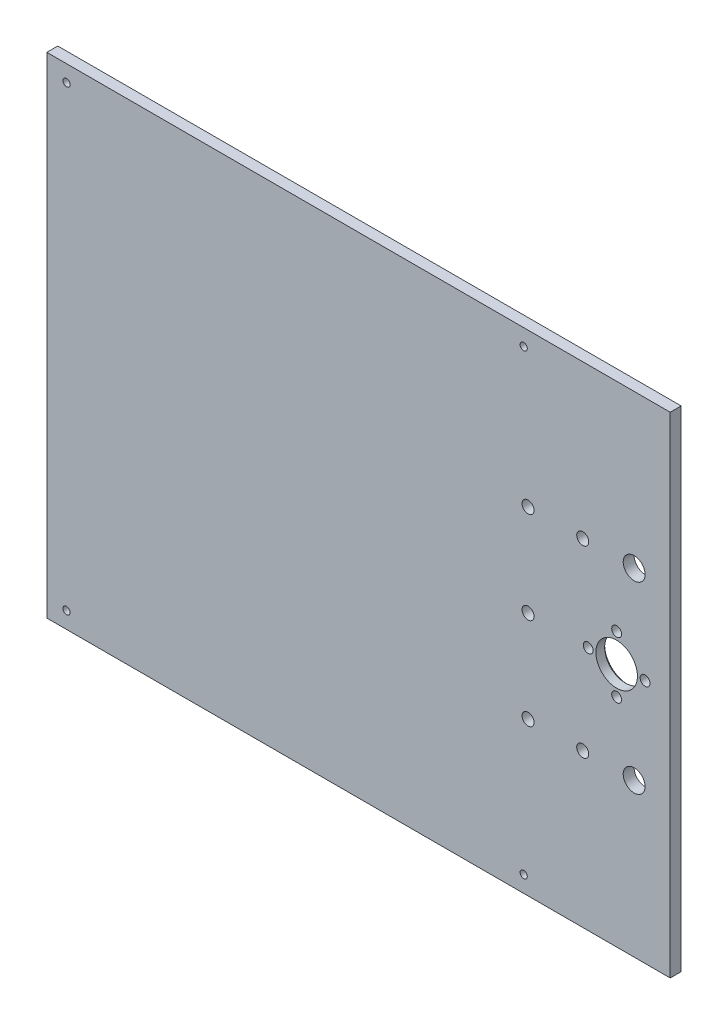
ISO-10303-21;
HEADER;
FILE_DESCRIPTION(('STEP AP214'),'2;1');
FILE_NAME('part.step','',(''),(''),'','','');
FILE_SCHEMA(('AUTOMOTIVE_DESIGN { 1 0 10303 214 1 1 1 1 }'));
ENDSEC;
DATA;
#1=APPLICATION_CONTEXT('core data for automotive mechanical design processes');
#2=APPLICATION_PROTOCOL_DEFINITION('international standard','automotive_design',2000,#1);
#3=PRODUCT_CONTEXT('',#1,'mechanical');
#4=PRODUCT('Part','Part','',(#3));
#5=PRODUCT_RELATED_PRODUCT_CATEGORY('part','',(#4));
#6=PRODUCT_DEFINITION_FORMATION('','',#4);
#7=PRODUCT_DEFINITION_CONTEXT('part definition',#1,'design');
#8=PRODUCT_DEFINITION('design','',#6,#7);
#9=PRODUCT_DEFINITION_SHAPE('','',#8);
#10=(LENGTH_UNIT() NAMED_UNIT(*) SI_UNIT(.MILLI.,.METRE.));
#11=(NAMED_UNIT(*) PLANE_ANGLE_UNIT() SI_UNIT($,.RADIAN.));
#12=(NAMED_UNIT(*) SI_UNIT($,.STERADIAN.) SOLID_ANGLE_UNIT());
#13=UNCERTAINTY_MEASURE_WITH_UNIT(LENGTH_MEASURE(1.E-05),#10,'distance_accuracy_value','');
#14=(GEOMETRIC_REPRESENTATION_CONTEXT(3) GLOBAL_UNCERTAINTY_ASSIGNED_CONTEXT((#13)) GLOBAL_UNIT_ASSIGNED_CONTEXT((#10,
#11,#12)) REPRESENTATION_CONTEXT('',''));
#15=CARTESIAN_POINT('',(0.,0.,0.));
#16=DIRECTION('',(0.,0.,1.));
#17=DIRECTION('',(1.,0.,0.));
#18=AXIS2_PLACEMENT_3D('',#15,#16,#17);
#19=CARTESIAN_POINT('',(0.,0.,0.));
#20=DIRECTION('',(0.,0.,1.));
#21=DIRECTION('',(1.,0.,0.));
#22=AXIS2_PLACEMENT_3D('',#19,#20,#21);
#23=PLANE('',#22);
#24=CARTESIAN_POINT('',(-66.9999999999999,27.5000000000032,0.));
#25=DIRECTION('',(0.,0.,-1.));
#26=DIRECTION('',(-1.,0.,0.));
#27=AXIS2_PLACEMENT_3D('',#24,#25,#26);
#28=CIRCLE('',#27,1.64999999999998);
#29=CARTESIAN_POINT('',(-68.6499999999999,27.5000000000032,0.));
#30=VERTEX_POINT('',#29);
#31=EDGE_CURVE('E352',#30,#30,#28,.T.);
#32=ORIENTED_EDGE('',*,*,#31,.F.);
#33=EDGE_LOOP('',(#32));
#34=FACE_BOUND('',#33,.T.);
#35=DIRECTION('',(0.,1.,0.));
#36=VECTOR('',#35,1.);
#37=CARTESIAN_POINT('',(0.,20.,0.));
#38=LINE('',#37,#36);
#39=CARTESIAN_POINT('',(0.,20.,0.));
#40=VERTEX_POINT('',#39);
#41=CARTESIAN_POINT('',(0.,244.,0.));
#42=VERTEX_POINT('',#41);
#43=EDGE_CURVE('E103',#40,#42,#38,.T.);
#44=ORIENTED_EDGE('',*,*,#43,.F.);
#45=DIRECTION('',(1.,0.,0.));
#46=VECTOR('',#45,1.);
#47=CARTESIAN_POINT('',(0.,20.,0.));
#48=LINE('',#47,#46);
#49=CARTESIAN_POINT('',(-285.,20.,0.));
#50=VERTEX_POINT('',#49);
#51=EDGE_CURVE('E75',#50,#40,#48,.T.);
#52=ORIENTED_EDGE('',*,*,#51,.F.);
#53=DIRECTION('',(0.,-1.,0.));
#54=VECTOR('',#53,1.);
#55=CARTESIAN_POINT('',(-285.,20.,0.));
#56=LINE('',#55,#54);
#57=CARTESIAN_POINT('',(-285.,244.,0.));
#58=VERTEX_POINT('',#57);
#59=EDGE_CURVE('E69',#58,#50,#56,.T.);
#60=ORIENTED_EDGE('',*,*,#59,.F.);
#61=DIRECTION('',(-1.,0.,0.));
#62=VECTOR('',#61,1.);
#63=CARTESIAN_POINT('',(0.,244.,0.));
#64=LINE('',#63,#62);
#65=EDGE_CURVE('E93',#42,#58,#64,.T.);
#66=ORIENTED_EDGE('',*,*,#65,.F.);
#67=EDGE_LOOP('',(#44,#52,#60,#66));
#68=FACE_BOUND('',#67,.T.);
#69=CARTESIAN_POINT('',(-24.5,132.,0.));
#70=DIRECTION('',(0.,0.,1.));
#71=DIRECTION('',(1.,0.,0.));
#72=AXIS2_PLACEMENT_3D('',#69,#70,#71);
#73=CIRCLE('',#72,10.5000000000001);
#74=CARTESIAN_POINT('',(-13.9999999999999,132.,0.));
#75=VERTEX_POINT('',#74);
#76=EDGE_CURVE('E11',#75,#75,#73,.T.);
#77=ORIENTED_EDGE('',*,*,#76,.T.);
#78=EDGE_LOOP('',(#77));
#79=FACE_BOUND('',#78,.T.);
#80=CARTESIAN_POINT('',(-11.4999999999997,132.,0.));
#81=DIRECTION('',(0.,0.,-1.));
#82=DIRECTION('',(-1.,0.,0.));
#83=AXIS2_PLACEMENT_3D('',#80,#81,#82);
#84=CIRCLE('',#83,2.24999999999999);
#85=CARTESIAN_POINT('',(-13.7499999999997,132.,0.));
#86=VERTEX_POINT('',#85);
#87=EDGE_CURVE('E433',#86,#86,#84,.T.);
#88=ORIENTED_EDGE('',*,*,#87,.F.);
#89=EDGE_LOOP('',(#88));
#90=FACE_BOUND('',#89,.T.);
#91=CARTESIAN_POINT('',(-24.4999999999999,145.,0.));
#92=DIRECTION('',(0.,0.,-1.));
#93=DIRECTION('',(-1.,0.,0.));
#94=AXIS2_PLACEMENT_3D('',#91,#92,#93);
#95=CIRCLE('',#94,2.24999999999999);
#96=CARTESIAN_POINT('',(-26.7499999999999,145.,0.));
#97=VERTEX_POINT('',#96);
#98=EDGE_CURVE('E427',#97,#97,#95,.T.);
#99=ORIENTED_EDGE('',*,*,#98,.F.);
#100=EDGE_LOOP('',(#99));
#101=FACE_BOUND('',#100,.T.);
#102=CARTESIAN_POINT('',(-37.5,132.,0.));
#103=DIRECTION('',(0.,0.,-1.));
#104=DIRECTION('',(-1.,0.,0.));
#105=AXIS2_PLACEMENT_3D('',#102,#103,#104);
#106=CIRCLE('',#105,2.24999999999999);
#107=CARTESIAN_POINT('',(-39.75,132.,0.));
#108=VERTEX_POINT('',#107);
#109=EDGE_CURVE('E421',#108,#108,#106,.T.);
#110=ORIENTED_EDGE('',*,*,#109,.F.);
#111=EDGE_LOOP('',(#110));
#112=FACE_BOUND('',#111,.T.);
#113=CARTESIAN_POINT('',(-24.5,119.,0.));
#114=DIRECTION('',(0.,0.,-1.));
#115=DIRECTION('',(-1.,0.,0.));
#116=AXIS2_PLACEMENT_3D('',#113,#114,#115);
#117=CIRCLE('',#116,2.24999999999999);
#118=CARTESIAN_POINT('',(-26.75,119.,0.));
#119=VERTEX_POINT('',#118);
#120=EDGE_CURVE('E415',#119,#119,#117,.T.);
#121=ORIENTED_EDGE('',*,*,#120,.F.);
#122=EDGE_LOOP('',(#121));
#123=FACE_BOUND('',#122,.T.);
#124=CARTESIAN_POINT('',(-16.5,90.,0.));
#125=DIRECTION('',(0.,0.,1.));
#126=DIRECTION('',(1.,0.,0.));
#127=AXIS2_PLACEMENT_3D('',#124,#125,#126);
#128=CIRCLE('',#127,5.00000000000001);
#129=CARTESIAN_POINT('',(-11.5,90.,0.));
#130=VERTEX_POINT('',#129);
#131=EDGE_CURVE('E412',#130,#130,#128,.F.);
#132=ORIENTED_EDGE('',*,*,#131,.F.);
#133=EDGE_LOOP('',(#132));
#134=FACE_BOUND('',#133,.T.);
#135=CARTESIAN_POINT('',(-16.5,174.,0.));
#136=DIRECTION('',(0.,0.,1.));
#137=DIRECTION('',(1.,0.,0.));
#138=AXIS2_PLACEMENT_3D('',#135,#136,#137);
#139=CIRCLE('',#138,5.);
#140=CARTESIAN_POINT('',(-11.5,174.,0.));
#141=VERTEX_POINT('',#140);
#142=EDGE_CURVE('E406',#141,#141,#139,.F.);
#143=ORIENTED_EDGE('',*,*,#142,.F.);
#144=EDGE_LOOP('',(#143));
#145=FACE_BOUND('',#144,.T.);
#146=CARTESIAN_POINT('',(-65.,90.,0.));
#147=DIRECTION('',(0.,0.,1.));
#148=DIRECTION('',(1.,0.,0.));
#149=AXIS2_PLACEMENT_3D('',#146,#147,#148);
#150=CIRCLE('',#149,2.75);
#151=CARTESIAN_POINT('',(-62.25,90.,0.));
#152=VERTEX_POINT('',#151);
#153=EDGE_CURVE('E400',#152,#152,#150,.T.);
#154=ORIENTED_EDGE('',*,*,#153,.T.);
#155=EDGE_LOOP('',(#154));
#156=FACE_BOUND('',#155,.T.);
#157=CARTESIAN_POINT('',(-65.,174.,0.));
#158=DIRECTION('',(0.,0.,1.));
#159=DIRECTION('',(1.,0.,0.));
#160=AXIS2_PLACEMENT_3D('',#157,#158,#159);
#161=CIRCLE('',#160,2.75);
#162=CARTESIAN_POINT('',(-62.25,174.,0.));
#163=VERTEX_POINT('',#162);
#164=EDGE_CURVE('E394',#163,#163,#161,.T.);
#165=ORIENTED_EDGE('',*,*,#164,.T.);
#166=EDGE_LOOP('',(#165));
#167=FACE_BOUND('',#166,.T.);
#168=CARTESIAN_POINT('',(-40.,174.,0.));
#169=DIRECTION('',(0.,0.,1.));
#170=DIRECTION('',(1.,0.,0.));
#171=AXIS2_PLACEMENT_3D('',#168,#169,#170);
#172=CIRCLE('',#171,2.74999999999999);
#173=CARTESIAN_POINT('',(-37.25,174.,0.));
#174=VERTEX_POINT('',#173);
#175=EDGE_CURVE('E388',#174,#174,#172,.T.);
#176=ORIENTED_EDGE('',*,*,#175,.T.);
#177=EDGE_LOOP('',(#176));
#178=FACE_BOUND('',#177,.T.);
#179=CARTESIAN_POINT('',(-65.,132.,0.));
#180=DIRECTION('',(0.,0.,1.));
#181=DIRECTION('',(1.,0.,0.));
#182=AXIS2_PLACEMENT_3D('',#179,#180,#181);
#183=CIRCLE('',#182,2.75);
#184=CARTESIAN_POINT('',(-62.25,132.,0.));
#185=VERTEX_POINT('',#184);
#186=EDGE_CURVE('E382',#185,#185,#183,.T.);
#187=ORIENTED_EDGE('',*,*,#186,.T.);
#188=EDGE_LOOP('',(#187));
#189=FACE_BOUND('',#188,.T.);
#190=CARTESIAN_POINT('',(-40.,90.,0.));
#191=DIRECTION('',(0.,0.,1.));
#192=DIRECTION('',(1.,0.,0.));
#193=AXIS2_PLACEMENT_3D('',#190,#191,#192);
#194=CIRCLE('',#193,2.74999999999999);
#195=CARTESIAN_POINT('',(-37.25,90.,0.));
#196=VERTEX_POINT('',#195);
#197=EDGE_CURVE('E376',#196,#196,#194,.T.);
#198=ORIENTED_EDGE('',*,*,#197,.T.);
#199=EDGE_LOOP('',(#198));
#200=FACE_BOUND('',#199,.T.);
#201=CARTESIAN_POINT('',(-66.9999999999999,236.500000000003,0.));
#202=DIRECTION('',(0.,0.,-1.));
#203=DIRECTION('',(-1.,0.,0.));
#204=AXIS2_PLACEMENT_3D('',#201,#202,#203);
#205=CIRCLE('',#204,1.64999999999998);
#206=CARTESIAN_POINT('',(-68.6499999999999,236.500000000003,0.));
#207=VERTEX_POINT('',#206);
#208=EDGE_CURVE('E367',#207,#207,#205,.T.);
#209=ORIENTED_EDGE('',*,*,#208,.F.);
#210=EDGE_LOOP('',(#209));
#211=FACE_BOUND('',#210,.T.);
#212=CARTESIAN_POINT('',(-276.,236.500000000003,0.));
#213=DIRECTION('',(0.,0.,-1.));
#214=DIRECTION('',(-1.,0.,0.));
#215=AXIS2_PLACEMENT_3D('',#212,#213,#214);
#216=CIRCLE('',#215,1.64999999999998);
#217=CARTESIAN_POINT('',(-277.65,236.500000000003,0.));
#218=VERTEX_POINT('',#217);
#219=EDGE_CURVE('E361',#218,#218,#216,.T.);
#220=ORIENTED_EDGE('',*,*,#219,.F.);
#221=EDGE_LOOP('',(#220));
#222=FACE_BOUND('',#221,.T.);
#223=CARTESIAN_POINT('',(-276.,27.5000000000032,0.));
#224=DIRECTION('',(0.,0.,-1.));
#225=DIRECTION('',(-1.,0.,0.));
#226=AXIS2_PLACEMENT_3D('',#223,#224,#225);
#227=CIRCLE('',#226,1.64999999999998);
#228=CARTESIAN_POINT('',(-277.65,27.5000000000032,0.));
#229=VERTEX_POINT('',#228);
#230=EDGE_CURVE('E348',#229,#229,#227,.T.);
#231=ORIENTED_EDGE('',*,*,#230,.F.);
#232=EDGE_LOOP('',(#231));
#233=FACE_BOUND('',#232,.T.);
#234=ADVANCED_FACE('F35',(#34,#68,#79,#90,#101,#112,#123,#134,#145,#156,#167,#178,#189,#200,
#211,#222,#233),#23,.F.);
#235=CARTESIAN_POINT('',(0.,20.,5.));
#236=DIRECTION('',(-1.,0.,0.));
#237=DIRECTION('',(0.,0.,1.));
#238=AXIS2_PLACEMENT_3D('',#235,#236,#237);
#239=PLANE('',#238);
#240=ORIENTED_EDGE('',*,*,#43,.T.);
#241=DIRECTION('',(0.,0.,-1.));
#242=VECTOR('',#241,1.);
#243=CARTESIAN_POINT('',(0.,244.,5.));
#244=LINE('',#243,#242);
#245=CARTESIAN_POINT('',(0.,244.,5.));
#246=VERTEX_POINT('',#245);
#247=EDGE_CURVE('E94',#246,#42,#244,.T.);
#248=ORIENTED_EDGE('',*,*,#247,.F.);
#249=DIRECTION('',(0.,1.,0.));
#250=VECTOR('',#249,1.);
#251=CARTESIAN_POINT('',(0.,20.,5.));
#252=LINE('',#251,#250);
#253=CARTESIAN_POINT('',(0.,20.,5.));
#254=VERTEX_POINT('',#253);
#255=EDGE_CURVE('E88',#254,#246,#252,.T.);
#256=ORIENTED_EDGE('',*,*,#255,.F.);
#257=DIRECTION('',(0.,0.,-1.));
#258=VECTOR('',#257,1.);
#259=CARTESIAN_POINT('',(0.,20.,5.));
#260=LINE('',#259,#258);
#261=EDGE_CURVE('E99',#254,#40,#260,.T.);
#262=ORIENTED_EDGE('',*,*,#261,.T.);
#263=EDGE_LOOP('',(#240,#248,#256,#262));
#264=FACE_BOUND('',#263,.T.);
#265=ADVANCED_FACE('F131',(#264),#239,.F.);
#266=CARTESIAN_POINT('',(0.,244.,5.));
#267=DIRECTION('',(0.,-1.,0.));
#268=DIRECTION('',(1.,0.,0.));
#269=AXIS2_PLACEMENT_3D('',#266,#267,#268);
#270=PLANE('',#269);
#271=ORIENTED_EDGE('',*,*,#65,.T.);
#272=DIRECTION('',(0.,0.,-1.));
#273=VECTOR('',#272,1.);
#274=CARTESIAN_POINT('',(-285.,244.,5.));
#275=LINE('',#274,#273);
#276=CARTESIAN_POINT('',(-285.,244.,5.));
#277=VERTEX_POINT('',#276);
#278=EDGE_CURVE('E91',#277,#58,#275,.T.);
#279=ORIENTED_EDGE('',*,*,#278,.F.);
#280=DIRECTION('',(-1.,0.,0.));
#281=VECTOR('',#280,1.);
#282=CARTESIAN_POINT('',(0.,244.,5.));
#283=LINE('',#282,#281);
#284=EDGE_CURVE('E83',#246,#277,#283,.T.);
#285=ORIENTED_EDGE('',*,*,#284,.F.);
#286=ORIENTED_EDGE('',*,*,#247,.T.);
#287=EDGE_LOOP('',(#271,#279,#285,#286));
#288=FACE_BOUND('',#287,.T.);
#289=ADVANCED_FACE('F92',(#288),#270,.F.);
#290=CARTESIAN_POINT('',(-285.,20.,5.));
#291=DIRECTION('',(1.,0.,0.));
#292=DIRECTION('',(0.,0.,-1.));
#293=AXIS2_PLACEMENT_3D('',#290,#291,#292);
#294=PLANE('',#293);
#295=ORIENTED_EDGE('',*,*,#59,.T.);
#296=DIRECTION('',(0.,0.,-1.));
#297=VECTOR('',#296,1.);
#298=CARTESIAN_POINT('',(-285.,20.,5.));
#299=LINE('',#298,#297);
#300=CARTESIAN_POINT('',(-285.,20.,5.));
#301=VERTEX_POINT('',#300);
#302=EDGE_CURVE('E95',#301,#50,#299,.T.);
#303=ORIENTED_EDGE('',*,*,#302,.F.);
#304=DIRECTION('',(0.,-1.,0.));
#305=VECTOR('',#304,1.);
#306=CARTESIAN_POINT('',(-285.,20.,5.));
#307=LINE('',#306,#305);
#308=EDGE_CURVE('E86',#277,#301,#307,.T.);
#309=ORIENTED_EDGE('',*,*,#308,.F.);
#310=ORIENTED_EDGE('',*,*,#278,.T.);
#311=EDGE_LOOP('',(#295,#303,#309,#310));
#312=FACE_BOUND('',#311,.T.);
#313=ADVANCED_FACE('F97',(#312),#294,.F.);
#314=CARTESIAN_POINT('',(0.,20.,5.));
#315=DIRECTION('',(0.,1.,0.));
#316=DIRECTION('',(-1.,0.,0.));
#317=AXIS2_PLACEMENT_3D('',#314,#315,#316);
#318=PLANE('',#317);
#319=ORIENTED_EDGE('',*,*,#51,.T.);
#320=ORIENTED_EDGE('',*,*,#261,.F.);
#321=DIRECTION('',(1.,0.,0.));
#322=VECTOR('',#321,1.);
#323=CARTESIAN_POINT('',(0.,20.,5.));
#324=LINE('',#323,#322);
#325=EDGE_CURVE('E52',#301,#254,#324,.T.);
#326=ORIENTED_EDGE('',*,*,#325,.F.);
#327=ORIENTED_EDGE('',*,*,#302,.T.);
#328=EDGE_LOOP('',(#319,#320,#326,#327));
#329=FACE_BOUND('',#328,.T.);
#330=ADVANCED_FACE('F142',(#329),#318,.F.);
#331=CARTESIAN_POINT('',(0.,0.,5.));
#332=DIRECTION('',(0.,0.,1.));
#333=DIRECTION('',(1.,0.,0.));
#334=AXIS2_PLACEMENT_3D('',#331,#332,#333);
#335=PLANE('',#334);
#336=CARTESIAN_POINT('',(-276.,27.5000000000032,5.));
#337=DIRECTION('',(0.,0.,1.));
#338=DIRECTION('',(1.,0.,0.));
#339=AXIS2_PLACEMENT_3D('',#336,#337,#338);
#340=CIRCLE('',#339,1.64999999999998);
#341=CARTESIAN_POINT('',(-274.35,27.5000000000032,5.));
#342=VERTEX_POINT('',#341);
#343=EDGE_CURVE('E351',#342,#342,#340,.T.);
#344=ORIENTED_EDGE('',*,*,#343,.F.);
#345=EDGE_LOOP('',(#344));
#346=FACE_BOUND('',#345,.T.);
#347=CARTESIAN_POINT('',(-66.9999999999999,27.5000000000032,5.));
#348=DIRECTION('',(0.,0.,1.));
#349=DIRECTION('',(1.,0.,0.));
#350=AXIS2_PLACEMENT_3D('',#347,#348,#349);
#351=CIRCLE('',#350,1.64999999999999);
#352=CARTESIAN_POINT('',(-65.35,27.5000000000032,5.));
#353=VERTEX_POINT('',#352);
#354=EDGE_CURVE('E355',#353,#353,#351,.T.);
#355=ORIENTED_EDGE('',*,*,#354,.F.);
#356=EDGE_LOOP('',(#355));
#357=FACE_BOUND('',#356,.T.);
#358=CARTESIAN_POINT('',(-276.,236.500000000003,5.));
#359=DIRECTION('',(0.,0.,1.));
#360=DIRECTION('',(1.,0.,0.));
#361=AXIS2_PLACEMENT_3D('',#358,#359,#360);
#362=CIRCLE('',#361,1.64999999999998);
#363=CARTESIAN_POINT('',(-274.35,236.500000000003,5.));
#364=VERTEX_POINT('',#363);
#365=EDGE_CURVE('E364',#364,#364,#362,.T.);
#366=ORIENTED_EDGE('',*,*,#365,.F.);
#367=EDGE_LOOP('',(#366));
#368=FACE_BOUND('',#367,.T.);
#369=CARTESIAN_POINT('',(-66.9999999999999,236.500000000003,5.));
#370=DIRECTION('',(0.,0.,1.));
#371=DIRECTION('',(1.,0.,0.));
#372=AXIS2_PLACEMENT_3D('',#369,#370,#371);
#373=CIRCLE('',#372,1.64999999999999);
#374=CARTESIAN_POINT('',(-65.35,236.500000000003,5.));
#375=VERTEX_POINT('',#374);
#376=EDGE_CURVE('E370',#375,#375,#373,.T.);
#377=ORIENTED_EDGE('',*,*,#376,.F.);
#378=EDGE_LOOP('',(#377));
#379=FACE_BOUND('',#378,.T.);
#380=CARTESIAN_POINT('',(-40.,90.,5.));
#381=DIRECTION('',(0.,0.,1.));
#382=DIRECTION('',(1.,0.,0.));
#383=AXIS2_PLACEMENT_3D('',#380,#381,#382);
#384=CIRCLE('',#383,2.74999999999999);
#385=CARTESIAN_POINT('',(-37.25,90.,5.));
#386=VERTEX_POINT('',#385);
#387=EDGE_CURVE('E373',#386,#386,#384,.T.);
#388=ORIENTED_EDGE('',*,*,#387,.F.);
#389=EDGE_LOOP('',(#388));
#390=FACE_BOUND('',#389,.T.);
#391=CARTESIAN_POINT('',(-65.,132.,5.));
#392=DIRECTION('',(0.,0.,1.));
#393=DIRECTION('',(1.,0.,0.));
#394=AXIS2_PLACEMENT_3D('',#391,#392,#393);
#395=CIRCLE('',#394,2.74999999999999);
#396=CARTESIAN_POINT('',(-62.25,132.,5.));
#397=VERTEX_POINT('',#396);
#398=EDGE_CURVE('E379',#397,#397,#395,.T.);
#399=ORIENTED_EDGE('',*,*,#398,.F.);
#400=EDGE_LOOP('',(#399));
#401=FACE_BOUND('',#400,.T.);
#402=CARTESIAN_POINT('',(-40.,174.,5.));
#403=DIRECTION('',(0.,0.,1.));
#404=DIRECTION('',(1.,0.,0.));
#405=AXIS2_PLACEMENT_3D('',#402,#403,#404);
#406=CIRCLE('',#405,2.74999999999999);
#407=CARTESIAN_POINT('',(-37.25,174.,5.));
#408=VERTEX_POINT('',#407);
#409=EDGE_CURVE('E385',#408,#408,#406,.T.);
#410=ORIENTED_EDGE('',*,*,#409,.F.);
#411=EDGE_LOOP('',(#410));
#412=FACE_BOUND('',#411,.T.);
#413=CARTESIAN_POINT('',(-65.,174.,5.));
#414=DIRECTION('',(0.,0.,1.));
#415=DIRECTION('',(1.,0.,0.));
#416=AXIS2_PLACEMENT_3D('',#413,#414,#415);
#417=CIRCLE('',#416,2.74999999999999);
#418=CARTESIAN_POINT('',(-62.25,174.,5.));
#419=VERTEX_POINT('',#418);
#420=EDGE_CURVE('E391',#419,#419,#417,.T.);
#421=ORIENTED_EDGE('',*,*,#420,.F.);
#422=EDGE_LOOP('',(#421));
#423=FACE_BOUND('',#422,.T.);
#424=CARTESIAN_POINT('',(-65.,90.,5.));
#425=DIRECTION('',(0.,0.,1.));
#426=DIRECTION('',(1.,0.,0.));
#427=AXIS2_PLACEMENT_3D('',#424,#425,#426);
#428=CIRCLE('',#427,2.74999999999999);
#429=CARTESIAN_POINT('',(-62.25,90.,5.));
#430=VERTEX_POINT('',#429);
#431=EDGE_CURVE('E397',#430,#430,#428,.T.);
#432=ORIENTED_EDGE('',*,*,#431,.F.);
#433=EDGE_LOOP('',(#432));
#434=FACE_BOUND('',#433,.T.);
#435=CARTESIAN_POINT('',(-16.5,174.,5.));
#436=DIRECTION('',(0.,0.,1.));
#437=DIRECTION('',(1.,0.,0.));
#438=AXIS2_PLACEMENT_3D('',#435,#436,#437);
#439=CIRCLE('',#438,5.);
#440=CARTESIAN_POINT('',(-11.5,174.,5.));
#441=VERTEX_POINT('',#440);
#442=EDGE_CURVE('E403',#441,#441,#439,.T.);
#443=ORIENTED_EDGE('',*,*,#442,.F.);
#444=EDGE_LOOP('',(#443));
#445=FACE_BOUND('',#444,.T.);
#446=CARTESIAN_POINT('',(-16.5,90.,5.));
#447=DIRECTION('',(0.,0.,1.));
#448=DIRECTION('',(1.,0.,0.));
#449=AXIS2_PLACEMENT_3D('',#446,#447,#448);
#450=CIRCLE('',#449,5.00000000000001);
#451=CARTESIAN_POINT('',(-11.5,90.,5.));
#452=VERTEX_POINT('',#451);
#453=EDGE_CURVE('E409',#452,#452,#450,.T.);
#454=ORIENTED_EDGE('',*,*,#453,.F.);
#455=EDGE_LOOP('',(#454));
#456=FACE_BOUND('',#455,.T.);
#457=CARTESIAN_POINT('',(-24.5,119.,5.));
#458=DIRECTION('',(0.,0.,1.));
#459=DIRECTION('',(1.,0.,0.));
#460=AXIS2_PLACEMENT_3D('',#457,#458,#459);
#461=CIRCLE('',#460,2.24999999999999);
#462=CARTESIAN_POINT('',(-22.2500000000001,119.,5.));
#463=VERTEX_POINT('',#462);
#464=EDGE_CURVE('E418',#463,#463,#461,.T.);
#465=ORIENTED_EDGE('',*,*,#464,.F.);
#466=EDGE_LOOP('',(#465));
#467=FACE_BOUND('',#466,.T.);
#468=CARTESIAN_POINT('',(-37.5,132.,5.));
#469=DIRECTION('',(0.,0.,1.));
#470=DIRECTION('',(1.,0.,0.));
#471=AXIS2_PLACEMENT_3D('',#468,#469,#470);
#472=CIRCLE('',#471,2.24999999999999);
#473=CARTESIAN_POINT('',(-35.25,132.,5.));
#474=VERTEX_POINT('',#473);
#475=EDGE_CURVE('E424',#474,#474,#472,.T.);
#476=ORIENTED_EDGE('',*,*,#475,.F.);
#477=EDGE_LOOP('',(#476));
#478=FACE_BOUND('',#477,.T.);
#479=CARTESIAN_POINT('',(-24.4999999999999,145.,5.));
#480=DIRECTION('',(0.,0.,1.));
#481=DIRECTION('',(1.,0.,0.));
#482=AXIS2_PLACEMENT_3D('',#479,#480,#481);
#483=CIRCLE('',#482,2.24999999999999);
#484=CARTESIAN_POINT('',(-22.2499999999999,145.,5.));
#485=VERTEX_POINT('',#484);
#486=EDGE_CURVE('E430',#485,#485,#483,.T.);
#487=ORIENTED_EDGE('',*,*,#486,.F.);
#488=EDGE_LOOP('',(#487));
#489=FACE_BOUND('',#488,.T.);
#490=CARTESIAN_POINT('',(-11.4999999999997,132.,5.));
#491=DIRECTION('',(0.,0.,1.));
#492=DIRECTION('',(1.,0.,0.));
#493=AXIS2_PLACEMENT_3D('',#490,#491,#492);
#494=CIRCLE('',#493,2.24999999999999);
#495=CARTESIAN_POINT('',(-9.24999999999975,132.,5.));
#496=VERTEX_POINT('',#495);
#497=EDGE_CURVE('E436',#496,#496,#494,.T.);
#498=ORIENTED_EDGE('',*,*,#497,.F.);
#499=EDGE_LOOP('',(#498));
#500=FACE_BOUND('',#499,.T.);
#501=CARTESIAN_POINT('',(-24.5,132.,5.));
#502=DIRECTION('',(0.,0.,1.));
#503=DIRECTION('',(1.,0.,0.));
#504=AXIS2_PLACEMENT_3D('',#501,#502,#503);
#505=CIRCLE('',#504,9.50000000000001);
#506=CARTESIAN_POINT('',(-15.,132.,5.));
#507=VERTEX_POINT('',#506);
#508=EDGE_CURVE('E106',#507,#507,#505,.F.);
#509=ORIENTED_EDGE('',*,*,#508,.T.);
#510=EDGE_LOOP('',(#509));
#511=FACE_BOUND('',#510,.T.);
#512=ORIENTED_EDGE('',*,*,#255,.T.);
#513=ORIENTED_EDGE('',*,*,#284,.T.);
#514=ORIENTED_EDGE('',*,*,#308,.T.);
#515=ORIENTED_EDGE('',*,*,#325,.T.);
#516=EDGE_LOOP('',(#512,#513,#514,#515));
#517=FACE_BOUND('',#516,.T.);
#518=ADVANCED_FACE('F84',(#346,#357,#368,#379,#390,#401,#412,#423,#434,#445,#456,#467,#478,#489,
#500,#511,#517),#335,.T.);
#519=CARTESIAN_POINT('',(-24.5,132.,5.001));
#520=DIRECTION('',(0.,0.,-1.));
#521=DIRECTION('',(-1.,0.,0.));
#522=AXIS2_PLACEMENT_3D('',#519,#520,#521);
#523=CYLINDRICAL_SURFACE('',#522,9.50000000000001);
#524=CARTESIAN_POINT('',(-24.5,132.,1.00000000000003));
#525=DIRECTION('',(0.,0.,1.));
#526=DIRECTION('',(1.,0.,0.));
#527=AXIS2_PLACEMENT_3D('',#524,#525,#526);
#528=CIRCLE('',#527,9.50000000000001);
#529=CARTESIAN_POINT('',(-15.,132.,1.00000000000003));
#530=VERTEX_POINT('',#529);
#531=EDGE_CURVE('E44',#530,#530,#528,.F.);
#532=ORIENTED_EDGE('',*,*,#531,.T.);
#533=EDGE_LOOP('',(#532));
#534=FACE_BOUND('',#533,.T.);
#535=ORIENTED_EDGE('',*,*,#508,.F.);
#536=EDGE_LOOP('',(#535));
#537=FACE_BOUND('',#536,.T.);
#538=ADVANCED_FACE('F115',(#534,#537),#523,.F.);
#539=CARTESIAN_POINT('',(-24.5,132.,1.00000000000003));
#540=DIRECTION('',(0.,0.,-1.));
#541=DIRECTION('',(-1.,0.,0.));
#542=AXIS2_PLACEMENT_3D('',#539,#540,#541);
#543=CONICAL_SURFACE('',#542,9.50000000000001,0.78539816339746);
#544=ORIENTED_EDGE('',*,*,#76,.F.);
#545=EDGE_LOOP('',(#544));
#546=FACE_BOUND('',#545,.T.);
#547=ORIENTED_EDGE('',*,*,#531,.F.);
#548=EDGE_LOOP('',(#547));
#549=FACE_BOUND('',#548,.T.);
#550=ADVANCED_FACE('F37',(#546,#549),#543,.F.);
#551=CARTESIAN_POINT('',(-11.4999999999997,132.,0.));
#552=DIRECTION('',(0.,0.,-1.));
#553=DIRECTION('',(-1.,0.,0.));
#554=AXIS2_PLACEMENT_3D('',#551,#552,#553);
#555=CYLINDRICAL_SURFACE('',#554,2.24999999999999);
#556=ORIENTED_EDGE('',*,*,#497,.T.);
#557=EDGE_LOOP('',(#556));
#558=FACE_BOUND('',#557,.T.);
#559=ORIENTED_EDGE('',*,*,#87,.T.);
#560=EDGE_LOOP('',(#559));
#561=FACE_BOUND('',#560,.T.);
#562=ADVANCED_FACE('F119',(#558,#561),#555,.F.);
#563=CARTESIAN_POINT('',(-24.4999999999999,145.,0.));
#564=DIRECTION('',(0.,0.,-1.));
#565=DIRECTION('',(-1.,0.,0.));
#566=AXIS2_PLACEMENT_3D('',#563,#564,#565);
#567=CYLINDRICAL_SURFACE('',#566,2.24999999999999);
#568=ORIENTED_EDGE('',*,*,#486,.T.);
#569=EDGE_LOOP('',(#568));
#570=FACE_BOUND('',#569,.T.);
#571=ORIENTED_EDGE('',*,*,#98,.T.);
#572=EDGE_LOOP('',(#571));
#573=FACE_BOUND('',#572,.T.);
#574=ADVANCED_FACE('F125',(#570,#573),#567,.F.);
#575=CARTESIAN_POINT('',(-37.5,132.,0.));
#576=DIRECTION('',(0.,0.,-1.));
#577=DIRECTION('',(-1.,0.,0.));
#578=AXIS2_PLACEMENT_3D('',#575,#576,#577);
#579=CYLINDRICAL_SURFACE('',#578,2.24999999999999);
#580=ORIENTED_EDGE('',*,*,#475,.T.);
#581=EDGE_LOOP('',(#580));
#582=FACE_BOUND('',#581,.T.);
#583=ORIENTED_EDGE('',*,*,#109,.T.);
#584=EDGE_LOOP('',(#583));
#585=FACE_BOUND('',#584,.T.);
#586=ADVANCED_FACE('F190',(#582,#585),#579,.F.);
#587=CARTESIAN_POINT('',(-24.5,119.,0.));
#588=DIRECTION('',(0.,0.,-1.));
#589=DIRECTION('',(-1.,0.,0.));
#590=AXIS2_PLACEMENT_3D('',#587,#588,#589);
#591=CYLINDRICAL_SURFACE('',#590,2.24999999999999);
#592=ORIENTED_EDGE('',*,*,#464,.T.);
#593=EDGE_LOOP('',(#592));
#594=FACE_BOUND('',#593,.T.);
#595=ORIENTED_EDGE('',*,*,#120,.T.);
#596=EDGE_LOOP('',(#595));
#597=FACE_BOUND('',#596,.T.);
#598=ADVANCED_FACE('F200',(#594,#597),#591,.F.);
#599=CARTESIAN_POINT('',(-16.5,90.,-0.001000000000001));
#600=DIRECTION('',(0.,0.,1.));
#601=DIRECTION('',(1.,0.,0.));
#602=AXIS2_PLACEMENT_3D('',#599,#600,#601);
#603=CYLINDRICAL_SURFACE('',#602,5.00000000000001);
#604=ORIENTED_EDGE('',*,*,#453,.T.);
#605=EDGE_LOOP('',(#604));
#606=FACE_BOUND('',#605,.T.);
#607=ORIENTED_EDGE('',*,*,#131,.T.);
#608=EDGE_LOOP('',(#607));
#609=FACE_BOUND('',#608,.T.);
#610=ADVANCED_FACE('F210',(#606,#609),#603,.F.);
#611=CARTESIAN_POINT('',(-16.5,174.,-0.001000000000001));
#612=DIRECTION('',(0.,0.,1.));
#613=DIRECTION('',(1.,0.,0.));
#614=AXIS2_PLACEMENT_3D('',#611,#612,#613);
#615=CYLINDRICAL_SURFACE('',#614,5.);
#616=ORIENTED_EDGE('',*,*,#442,.T.);
#617=EDGE_LOOP('',(#616));
#618=FACE_BOUND('',#617,.T.);
#619=ORIENTED_EDGE('',*,*,#142,.T.);
#620=EDGE_LOOP('',(#619));
#621=FACE_BOUND('',#620,.T.);
#622=ADVANCED_FACE('F220',(#618,#621),#615,.F.);
#623=CARTESIAN_POINT('',(-65.,90.,5.));
#624=DIRECTION('',(0.,0.,1.));
#625=DIRECTION('',(1.,0.,0.));
#626=AXIS2_PLACEMENT_3D('',#623,#624,#625);
#627=CYLINDRICAL_SURFACE('',#626,2.75);
#628=ORIENTED_EDGE('',*,*,#153,.F.);
#629=EDGE_LOOP('',(#628));
#630=FACE_BOUND('',#629,.T.);
#631=ORIENTED_EDGE('',*,*,#431,.T.);
#632=EDGE_LOOP('',(#631));
#633=FACE_BOUND('',#632,.T.);
#634=ADVANCED_FACE('F230',(#630,#633),#627,.F.);
#635=CARTESIAN_POINT('',(-65.,174.,5.));
#636=DIRECTION('',(0.,0.,1.));
#637=DIRECTION('',(1.,0.,0.));
#638=AXIS2_PLACEMENT_3D('',#635,#636,#637);
#639=CYLINDRICAL_SURFACE('',#638,2.75);
#640=ORIENTED_EDGE('',*,*,#164,.F.);
#641=EDGE_LOOP('',(#640));
#642=FACE_BOUND('',#641,.T.);
#643=ORIENTED_EDGE('',*,*,#420,.T.);
#644=EDGE_LOOP('',(#643));
#645=FACE_BOUND('',#644,.T.);
#646=ADVANCED_FACE('F240',(#642,#645),#639,.F.);
#647=CARTESIAN_POINT('',(-40.,174.,5.));
#648=DIRECTION('',(0.,0.,1.));
#649=DIRECTION('',(1.,0.,0.));
#650=AXIS2_PLACEMENT_3D('',#647,#648,#649);
#651=CYLINDRICAL_SURFACE('',#650,2.74999999999999);
#652=ORIENTED_EDGE('',*,*,#175,.F.);
#653=EDGE_LOOP('',(#652));
#654=FACE_BOUND('',#653,.T.);
#655=ORIENTED_EDGE('',*,*,#409,.T.);
#656=EDGE_LOOP('',(#655));
#657=FACE_BOUND('',#656,.T.);
#658=ADVANCED_FACE('F250',(#654,#657),#651,.F.);
#659=CARTESIAN_POINT('',(-65.,132.,5.));
#660=DIRECTION('',(0.,0.,1.));
#661=DIRECTION('',(1.,0.,0.));
#662=AXIS2_PLACEMENT_3D('',#659,#660,#661);
#663=CYLINDRICAL_SURFACE('',#662,2.75);
#664=ORIENTED_EDGE('',*,*,#186,.F.);
#665=EDGE_LOOP('',(#664));
#666=FACE_BOUND('',#665,.T.);
#667=ORIENTED_EDGE('',*,*,#398,.T.);
#668=EDGE_LOOP('',(#667));
#669=FACE_BOUND('',#668,.T.);
#670=ADVANCED_FACE('F260',(#666,#669),#663,.F.);
#671=CARTESIAN_POINT('',(-40.,90.,5.));
#672=DIRECTION('',(0.,0.,1.));
#673=DIRECTION('',(1.,0.,0.));
#674=AXIS2_PLACEMENT_3D('',#671,#672,#673);
#675=CYLINDRICAL_SURFACE('',#674,2.74999999999999);
#676=ORIENTED_EDGE('',*,*,#197,.F.);
#677=EDGE_LOOP('',(#676));
#678=FACE_BOUND('',#677,.T.);
#679=ORIENTED_EDGE('',*,*,#387,.T.);
#680=EDGE_LOOP('',(#679));
#681=FACE_BOUND('',#680,.T.);
#682=ADVANCED_FACE('F270',(#678,#681),#675,.F.);
#683=CARTESIAN_POINT('',(-66.9999999999999,236.500000000003,0.));
#684=DIRECTION('',(0.,0.,-1.));
#685=DIRECTION('',(-1.,0.,0.));
#686=AXIS2_PLACEMENT_3D('',#683,#684,#685);
#687=CYLINDRICAL_SURFACE('',#686,1.64999999999999);
#688=ORIENTED_EDGE('',*,*,#208,.T.);
#689=EDGE_LOOP('',(#688));
#690=FACE_BOUND('',#689,.T.);
#691=ORIENTED_EDGE('',*,*,#376,.T.);
#692=EDGE_LOOP('',(#691));
#693=FACE_BOUND('',#692,.T.);
#694=ADVANCED_FACE('F279',(#690,#693),#687,.F.);
#695=CARTESIAN_POINT('',(-276.,236.500000000003,0.));
#696=DIRECTION('',(0.,0.,-1.));
#697=DIRECTION('',(-1.,0.,0.));
#698=AXIS2_PLACEMENT_3D('',#695,#696,#697);
#699=CYLINDRICAL_SURFACE('',#698,1.64999999999998);
#700=ORIENTED_EDGE('',*,*,#219,.T.);
#701=EDGE_LOOP('',(#700));
#702=FACE_BOUND('',#701,.T.);
#703=ORIENTED_EDGE('',*,*,#365,.T.);
#704=EDGE_LOOP('',(#703));
#705=FACE_BOUND('',#704,.T.);
#706=ADVANCED_FACE('F294',(#702,#705),#699,.F.);
#707=CARTESIAN_POINT('',(-66.9999999999999,27.5000000000032,0.));
#708=DIRECTION('',(0.,0.,-1.));
#709=DIRECTION('',(-1.,0.,0.));
#710=AXIS2_PLACEMENT_3D('',#707,#708,#709);
#711=CYLINDRICAL_SURFACE('',#710,1.64999999999999);
#712=ORIENTED_EDGE('',*,*,#31,.T.);
#713=EDGE_LOOP('',(#712));
#714=FACE_BOUND('',#713,.T.);
#715=ORIENTED_EDGE('',*,*,#354,.T.);
#716=EDGE_LOOP('',(#715));
#717=FACE_BOUND('',#716,.T.);
#718=ADVANCED_FACE('F304',(#714,#717),#711,.F.);
#719=CARTESIAN_POINT('',(-276.,27.5000000000032,0.));
#720=DIRECTION('',(0.,0.,-1.));
#721=DIRECTION('',(-1.,0.,0.));
#722=AXIS2_PLACEMENT_3D('',#719,#720,#721);
#723=CYLINDRICAL_SURFACE('',#722,1.64999999999998);
#724=ORIENTED_EDGE('',*,*,#230,.T.);
#725=EDGE_LOOP('',(#724));
#726=FACE_BOUND('',#725,.T.);
#727=ORIENTED_EDGE('',*,*,#343,.T.);
#728=EDGE_LOOP('',(#727));
#729=FACE_BOUND('',#728,.T.);
#730=ADVANCED_FACE('F314',(#726,#729),#723,.F.);
#731=CLOSED_SHELL('',(#234,#265,#289,#313,#330,#518,#538,#550,#562,#574,#586,#598,#610,#622,
#634,#646,#658,#670,#682,#694,#706,#718,#730));
#732=MANIFOLD_SOLID_BREP('B2',#731);
#733=ADVANCED_BREP_SHAPE_REPRESENTATION('',(#18,#732),#14);
#734=SHAPE_DEFINITION_REPRESENTATION(#9,#733);
ENDSEC;
END-ISO-10303-21;
